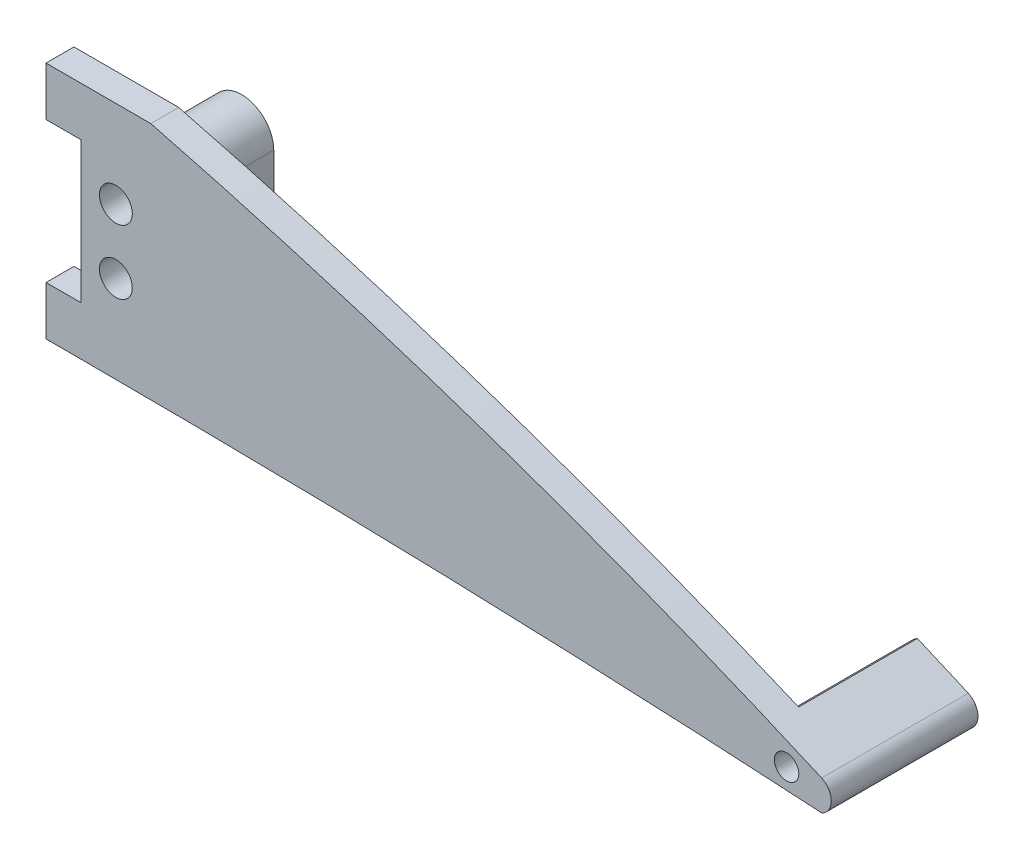
ISO-10303-21;
HEADER;
FILE_DESCRIPTION(('STEP AP214'),'2;1');
FILE_NAME('part.step','',(''),(''),'','','');
FILE_SCHEMA(('AUTOMOTIVE_DESIGN { 1 0 10303 214 1 1 1 1 }'));
ENDSEC;
DATA;
#1=APPLICATION_CONTEXT('core data for automotive mechanical design processes');
#2=APPLICATION_PROTOCOL_DEFINITION('international standard','automotive_design',2000,#1);
#3=PRODUCT_CONTEXT('',#1,'mechanical');
#4=PRODUCT('Part','Part','',(#3));
#5=PRODUCT_RELATED_PRODUCT_CATEGORY('part','',(#4));
#6=PRODUCT_DEFINITION_FORMATION('','',#4);
#7=PRODUCT_DEFINITION_CONTEXT('part definition',#1,'design');
#8=PRODUCT_DEFINITION('design','',#6,#7);
#9=PRODUCT_DEFINITION_SHAPE('','',#8);
#10=(LENGTH_UNIT() NAMED_UNIT(*) SI_UNIT(.MILLI.,.METRE.));
#11=(NAMED_UNIT(*) PLANE_ANGLE_UNIT() SI_UNIT($,.RADIAN.));
#12=(NAMED_UNIT(*) SI_UNIT($,.STERADIAN.) SOLID_ANGLE_UNIT());
#13=UNCERTAINTY_MEASURE_WITH_UNIT(LENGTH_MEASURE(1.E-05),#10,'distance_accuracy_value','');
#14=(GEOMETRIC_REPRESENTATION_CONTEXT(3) GLOBAL_UNCERTAINTY_ASSIGNED_CONTEXT((#13)) GLOBAL_UNIT_ASSIGNED_CONTEXT((#10,
#11,#12)) REPRESENTATION_CONTEXT('',''));
#15=CARTESIAN_POINT('',(0.,0.,0.));
#16=DIRECTION('',(0.,0.,1.));
#17=DIRECTION('',(1.,0.,0.));
#18=AXIS2_PLACEMENT_3D('',#15,#16,#17);
#19=CARTESIAN_POINT('',(125.2,-18.184180882781,-4.));
#20=DIRECTION('',(0.,0.,1.));
#21=DIRECTION('',(-1.,0.,0.));
#22=AXIS2_PLACEMENT_3D('',#19,#20,#21);
#23=PLANE('',#22);
#24=CARTESIAN_POINT('',(121.606035169385,-17.1322224625287,-4.));
#25=DIRECTION('',(0.,0.,1.));
#26=DIRECTION('',(-1.,0.,0.));
#27=AXIS2_PLACEMENT_3D('',#24,#25,#26);
#28=CIRCLE('',#27,5.04570951350734);
#29=CARTESIAN_POINT('',(118.922411718287,-12.859360462951,-4.));
#30=VERTEX_POINT('',#29);
#31=CARTESIAN_POINT('',(117.333173169808,-19.8158459136246,-4.));
#32=VERTEX_POINT('',#31);
#33=EDGE_CURVE('E208',#30,#32,#28,.T.);
#34=ORIENTED_EDGE('',*,*,#33,.T.);
#35=CARTESIAN_POINT('',(19.1973795010577,-1791.50291617273,-4.));
#36=DIRECTION('',(0.,0.,-1.));
#37=DIRECTION('',(-1.,0.,0.));
#38=AXIS2_PLACEMENT_3D('',#35,#36,#37);
#39=CIRCLE('',#38,1774.40291617273);
#40=CARTESIAN_POINT('',(19.1973795010615,-17.1000000000001,-4.));
#41=VERTEX_POINT('',#40);
#42=EDGE_CURVE('E274',#41,#32,#39,.T.);
#43=ORIENTED_EDGE('',*,*,#42,.F.);
#44=DIRECTION('',(1.,0.,0.));
#45=VECTOR('',#44,1.);
#46=CARTESIAN_POINT('',(15.2,-17.1,-4.));
#47=LINE('',#46,#45);
#48=CARTESIAN_POINT('',(15.2,-17.1,-4.));
#49=VERTEX_POINT('',#48);
#50=EDGE_CURVE('E270',#49,#41,#47,.T.);
#51=ORIENTED_EDGE('',*,*,#50,.F.);
#52=DIRECTION('',(0.,-1.,0.));
#53=VECTOR('',#52,1.);
#54=CARTESIAN_POINT('',(15.2,-10.1,-4.));
#55=LINE('',#54,#53);
#56=CARTESIAN_POINT('',(15.2,-10.1,-4.));
#57=VERTEX_POINT('',#56);
#58=EDGE_CURVE('E266',#57,#49,#55,.T.);
#59=ORIENTED_EDGE('',*,*,#58,.F.);
#60=DIRECTION('',(-1.,0.,0.));
#61=VECTOR('',#60,1.);
#62=CARTESIAN_POINT('',(15.2,-10.1,-4.));
#63=LINE('',#62,#61);
#64=CARTESIAN_POINT('',(20.2,-10.1,-4.));
#65=VERTEX_POINT('',#64);
#66=EDGE_CURVE('E262',#65,#57,#63,.T.);
#67=ORIENTED_EDGE('',*,*,#66,.F.);
#68=DIRECTION('',(0.,-1.,0.));
#69=VECTOR('',#68,1.);
#70=CARTESIAN_POINT('',(20.2,10.1,-4.));
#71=LINE('',#70,#69);
#72=CARTESIAN_POINT('',(20.2,10.1,-4.));
#73=VERTEX_POINT('',#72);
#74=EDGE_CURVE('E258',#73,#65,#71,.T.);
#75=ORIENTED_EDGE('',*,*,#74,.F.);
#76=DIRECTION('',(1.,0.,0.));
#77=VECTOR('',#76,1.);
#78=CARTESIAN_POINT('',(15.2,10.1,-4.));
#79=LINE('',#78,#77);
#80=CARTESIAN_POINT('',(15.2,10.1,-4.));
#81=VERTEX_POINT('',#80);
#82=EDGE_CURVE('E254',#81,#73,#79,.T.);
#83=ORIENTED_EDGE('',*,*,#82,.F.);
#84=DIRECTION('',(0.,-1.,0.));
#85=VECTOR('',#84,1.);
#86=CARTESIAN_POINT('',(15.2,17.1,-4.));
#87=LINE('',#86,#85);
#88=CARTESIAN_POINT('',(15.2,17.1,-4.));
#89=VERTEX_POINT('',#88);
#90=EDGE_CURVE('E250',#89,#81,#87,.T.);
#91=ORIENTED_EDGE('',*,*,#90,.F.);
#92=DIRECTION('',(-1.,0.,0.));
#93=VECTOR('',#92,1.);
#94=CARTESIAN_POINT('',(15.2,17.1,-4.));
#95=LINE('',#94,#93);
#96=CARTESIAN_POINT('',(30.2000000000001,17.1000000000001,-4.));
#97=VERTEX_POINT('',#96);
#98=EDGE_CURVE('E245',#97,#89,#95,.T.);
#99=ORIENTED_EDGE('',*,*,#98,.F.);
#100=CARTESIAN_POINT('',(-123.166643251558,-583.435959333798,-4.));
#101=DIRECTION('',(0.,0.,1.));
#102=DIRECTION('',(-1.,0.,0.));
#103=AXIS2_PLACEMENT_3D('',#100,#101,#102);
#104=CIRCLE('',#103,619.810265900151);
#105=EDGE_CURVE('E241',#30,#97,#104,.T.);
#106=ORIENTED_EDGE('',*,*,#105,.F.);
#107=EDGE_LOOP('',(#34,#43,#51,#59,#67,#75,#83,#91,#99,#106));
#108=FACE_BOUND('',#107,.T.);
#109=CARTESIAN_POINT('',(25.2,-4.6,-4.));
#110=DIRECTION('',(0.,0.,1.));
#111=DIRECTION('',(1.,0.,0.));
#112=AXIS2_PLACEMENT_3D('',#109,#110,#111);
#113=CIRCLE('',#112,4.6);
#114=CARTESIAN_POINT('',(20.6,-4.6,-4.));
#115=VERTEX_POINT('',#114);
#116=CARTESIAN_POINT('',(29.8,-4.6,-4.));
#117=VERTEX_POINT('',#116);
#118=EDGE_CURVE('E190',#115,#117,#113,.T.);
#119=ORIENTED_EDGE('',*,*,#118,.T.);
#120=DIRECTION('',(0.,1.,0.));
#121=VECTOR('',#120,1.);
#122=CARTESIAN_POINT('',(29.8,-4.6,-4.));
#123=LINE('',#122,#121);
#124=CARTESIAN_POINT('',(29.8,4.6,-4.));
#125=VERTEX_POINT('',#124);
#126=EDGE_CURVE('E167',#117,#125,#123,.T.);
#127=ORIENTED_EDGE('',*,*,#126,.T.);
#128=CARTESIAN_POINT('',(25.2,4.6,-4.));
#129=DIRECTION('',(0.,0.,1.));
#130=DIRECTION('',(1.,0.,0.));
#131=AXIS2_PLACEMENT_3D('',#128,#129,#130);
#132=CIRCLE('',#131,4.6);
#133=CARTESIAN_POINT('',(20.6,4.6,-4.));
#134=VERTEX_POINT('',#133);
#135=EDGE_CURVE('E180',#125,#134,#132,.T.);
#136=ORIENTED_EDGE('',*,*,#135,.T.);
#137=DIRECTION('',(0.,-1.,0.));
#138=VECTOR('',#137,1.);
#139=CARTESIAN_POINT('',(20.6,-4.6,-4.));
#140=LINE('',#139,#138);
#141=EDGE_CURVE('E175',#134,#115,#140,.T.);
#142=ORIENTED_EDGE('',*,*,#141,.T.);
#143=EDGE_LOOP('',(#119,#127,#136,#142));
#144=FACE_BOUND('',#143,.T.);
#145=ADVANCED_FACE('F40',(#108,#144),#23,.F.);
#146=CARTESIAN_POINT('',(125.2,-18.184180882781,0.));
#147=DIRECTION('',(0.,0.,1.));
#148=DIRECTION('',(-1.,0.,0.));
#149=AXIS2_PLACEMENT_3D('',#146,#147,#148);
#150=PLANE('',#149);
#151=CARTESIAN_POINT('',(121.2,-17.1334379572921,0.));
#152=DIRECTION('',(0.,0.,-1.));
#153=DIRECTION('',(-1.,0.,0.));
#154=AXIS2_PLACEMENT_3D('',#151,#152,#153);
#155=CIRCLE('',#154,1.75);
#156=CARTESIAN_POINT('',(119.45,-17.1334379572921,0.));
#157=VERTEX_POINT('',#156);
#158=EDGE_CURVE('E183',#157,#157,#155,.T.);
#159=ORIENTED_EDGE('',*,*,#158,.T.);
#160=EDGE_LOOP('',(#159));
#161=FACE_BOUND('',#160,.T.);
#162=CARTESIAN_POINT('',(25.2,4.6,0.));
#163=DIRECTION('',(0.,0.,1.));
#164=DIRECTION('',(-1.,0.,0.));
#165=AXIS2_PLACEMENT_3D('',#162,#163,#164);
#166=CIRCLE('',#165,2.35);
#167=CARTESIAN_POINT('',(22.85,4.6,0.));
#168=VERTEX_POINT('',#167);
#169=EDGE_CURVE('E236',#168,#168,#166,.T.);
#170=ORIENTED_EDGE('',*,*,#169,.F.);
#171=EDGE_LOOP('',(#170));
#172=FACE_BOUND('',#171,.T.);
#173=CARTESIAN_POINT('',(125.2,-18.184180882781,0.));
#174=DIRECTION('',(0.,0.,1.));
#175=DIRECTION('',(-1.,0.,0.));
#176=AXIS2_PLACEMENT_3D('',#173,#174,#175);
#177=CIRCLE('',#176,2.40054797434142);
#178=CARTESIAN_POINT('',(126.269263580591,-20.3334379572921,0.));
#179=VERTEX_POINT('',#178);
#180=CARTESIAN_POINT('',(126.216652739476,-16.0095434912992,0.));
#181=VERTEX_POINT('',#180);
#182=EDGE_CURVE('E240',#179,#181,#177,.T.);
#183=ORIENTED_EDGE('',*,*,#182,.T.);
#184=CARTESIAN_POINT('',(-123.166643251558,-583.435959333798,0.));
#185=DIRECTION('',(0.,0.,1.));
#186=DIRECTION('',(-1.,0.,0.));
#187=AXIS2_PLACEMENT_3D('',#184,#185,#186);
#188=CIRCLE('',#187,619.810265900151);
#189=CARTESIAN_POINT('',(30.2000000000001,17.1000000000001,0.));
#190=VERTEX_POINT('',#189);
#191=EDGE_CURVE('E282',#181,#190,#188,.T.);
#192=ORIENTED_EDGE('',*,*,#191,.T.);
#193=DIRECTION('',(-1.,0.,0.));
#194=VECTOR('',#193,1.);
#195=CARTESIAN_POINT('',(15.2,17.1,0.));
#196=LINE('',#195,#194);
#197=CARTESIAN_POINT('',(15.2,17.1,0.));
#198=VERTEX_POINT('',#197);
#199=EDGE_CURVE('E286',#190,#198,#196,.T.);
#200=ORIENTED_EDGE('',*,*,#199,.T.);
#201=DIRECTION('',(0.,-1.,0.));
#202=VECTOR('',#201,1.);
#203=CARTESIAN_POINT('',(15.2,17.1,0.));
#204=LINE('',#203,#202);
#205=CARTESIAN_POINT('',(15.2,10.1,0.));
#206=VERTEX_POINT('',#205);
#207=EDGE_CURVE('E290',#198,#206,#204,.T.);
#208=ORIENTED_EDGE('',*,*,#207,.T.);
#209=DIRECTION('',(1.,0.,0.));
#210=VECTOR('',#209,1.);
#211=CARTESIAN_POINT('',(15.2,10.1,0.));
#212=LINE('',#211,#210);
#213=CARTESIAN_POINT('',(20.2,10.1,0.));
#214=VERTEX_POINT('',#213);
#215=EDGE_CURVE('E294',#206,#214,#212,.T.);
#216=ORIENTED_EDGE('',*,*,#215,.T.);
#217=DIRECTION('',(0.,-1.,0.));
#218=VECTOR('',#217,1.);
#219=CARTESIAN_POINT('',(20.2,10.1,0.));
#220=LINE('',#219,#218);
#221=CARTESIAN_POINT('',(20.2,-10.1,0.));
#222=VERTEX_POINT('',#221);
#223=EDGE_CURVE('E298',#214,#222,#220,.T.);
#224=ORIENTED_EDGE('',*,*,#223,.T.);
#225=DIRECTION('',(-1.,0.,0.));
#226=VECTOR('',#225,1.);
#227=CARTESIAN_POINT('',(15.2,-10.1,0.));
#228=LINE('',#227,#226);
#229=CARTESIAN_POINT('',(15.2,-10.1,0.));
#230=VERTEX_POINT('',#229);
#231=EDGE_CURVE('E302',#222,#230,#228,.T.);
#232=ORIENTED_EDGE('',*,*,#231,.T.);
#233=DIRECTION('',(0.,-1.,0.));
#234=VECTOR('',#233,1.);
#235=CARTESIAN_POINT('',(15.2,-10.1,0.));
#236=LINE('',#235,#234);
#237=CARTESIAN_POINT('',(15.2,-17.1,0.));
#238=VERTEX_POINT('',#237);
#239=EDGE_CURVE('E306',#230,#238,#236,.T.);
#240=ORIENTED_EDGE('',*,*,#239,.T.);
#241=DIRECTION('',(1.,0.,0.));
#242=VECTOR('',#241,1.);
#243=CARTESIAN_POINT('',(15.2,-17.1,0.));
#244=LINE('',#243,#242);
#245=CARTESIAN_POINT('',(19.1973795010615,-17.1000000000001,0.));
#246=VERTEX_POINT('',#245);
#247=EDGE_CURVE('E310',#238,#246,#244,.T.);
#248=ORIENTED_EDGE('',*,*,#247,.T.);
#249=CARTESIAN_POINT('',(19.1973795010577,-1791.50291617273,0.));
#250=DIRECTION('',(0.,0.,-1.));
#251=DIRECTION('',(-1.,0.,0.));
#252=AXIS2_PLACEMENT_3D('',#249,#250,#251);
#253=CIRCLE('',#252,1774.40291617273);
#254=EDGE_CURVE('E246',#246,#179,#253,.T.);
#255=ORIENTED_EDGE('',*,*,#254,.T.);
#256=EDGE_LOOP('',(#183,#192,#200,#208,#216,#224,#232,#240,#248,#255));
#257=FACE_BOUND('',#256,.T.);
#258=CARTESIAN_POINT('',(25.2,-4.6,0.));
#259=DIRECTION('',(0.,0.,1.));
#260=DIRECTION('',(1.,0.,0.));
#261=AXIS2_PLACEMENT_3D('',#258,#259,#260);
#262=CIRCLE('',#261,2.35);
#263=CARTESIAN_POINT('',(27.55,-4.6,0.));
#264=VERTEX_POINT('',#263);
#265=EDGE_CURVE('E232',#264,#264,#262,.T.);
#266=ORIENTED_EDGE('',*,*,#265,.F.);
#267=EDGE_LOOP('',(#266));
#268=FACE_BOUND('',#267,.T.);
#269=ADVANCED_FACE('F354',(#161,#172,#257,#268),#150,.T.);
#270=CARTESIAN_POINT('',(125.2,-18.184180882781,-4.));
#271=DIRECTION('',(0.,0.,1.));
#272=DIRECTION('',(-1.,0.,0.));
#273=AXIS2_PLACEMENT_3D('',#270,#271,#272);
#274=CYLINDRICAL_SURFACE('',#273,2.40054797434142);
#275=ORIENTED_EDGE('',*,*,#182,.F.);
#276=DIRECTION('',(0.,0.,1.));
#277=VECTOR('',#276,1.);
#278=CARTESIAN_POINT('',(126.269263580591,-20.3334379572921,-4.));
#279=LINE('',#278,#277);
#280=CARTESIAN_POINT('',(126.269263580591,-20.3334379572921,-21.));
#281=VERTEX_POINT('',#280);
#282=EDGE_CURVE('E278',#281,#179,#279,.T.);
#283=ORIENTED_EDGE('',*,*,#282,.F.);
#284=CARTESIAN_POINT('',(125.2,-18.184180882781,-21.));
#285=DIRECTION('',(0.,0.,1.));
#286=DIRECTION('',(1.,0.,0.));
#287=AXIS2_PLACEMENT_3D('',#284,#285,#286);
#288=CIRCLE('',#287,2.40054797434144);
#289=CARTESIAN_POINT('',(126.216652739476,-16.0095434912992,-21.));
#290=VERTEX_POINT('',#289);
#291=EDGE_CURVE('E209',#281,#290,#288,.T.);
#292=ORIENTED_EDGE('',*,*,#291,.T.);
#293=DIRECTION('',(0.,0.,1.));
#294=VECTOR('',#293,1.);
#295=CARTESIAN_POINT('',(126.216652739476,-16.0095434912992,-4.));
#296=LINE('',#295,#294);
#297=EDGE_CURVE('E11',#290,#181,#296,.T.);
#298=ORIENTED_EDGE('',*,*,#297,.T.);
#299=EDGE_LOOP('',(#275,#283,#292,#298));
#300=FACE_BOUND('',#299,.T.);
#301=ADVANCED_FACE('F42',(#300),#274,.T.);
#302=CARTESIAN_POINT('',(-123.166643251558,-583.435959333798,-4.));
#303=DIRECTION('',(0.,0.,1.));
#304=DIRECTION('',(-1.,0.,0.));
#305=AXIS2_PLACEMENT_3D('',#302,#303,#304);
#306=CYLINDRICAL_SURFACE('',#305,619.810265900151);
#307=ORIENTED_EDGE('',*,*,#191,.F.);
#308=ORIENTED_EDGE('',*,*,#297,.F.);
#309=CARTESIAN_POINT('',(-123.166643251558,-583.435959333798,-21.));
#310=DIRECTION('',(0.,0.,1.));
#311=DIRECTION('',(1.,0.,0.));
#312=AXIS2_PLACEMENT_3D('',#309,#310,#311);
#313=CIRCLE('',#312,619.810265900151);
#314=CARTESIAN_POINT('',(118.922411718289,-12.859360462952,-21.));
#315=VERTEX_POINT('',#314);
#316=EDGE_CURVE('E213',#290,#315,#313,.T.);
#317=ORIENTED_EDGE('',*,*,#316,.T.);
#318=DIRECTION('',(0.,0.,1.));
#319=VECTOR('',#318,1.);
#320=CARTESIAN_POINT('',(118.922411718289,-12.859360462952,-21.));
#321=LINE('',#320,#319);
#322=EDGE_CURVE('E229',#315,#30,#321,.T.);
#323=ORIENTED_EDGE('',*,*,#322,.T.);
#324=ORIENTED_EDGE('',*,*,#105,.T.);
#325=DIRECTION('',(0.,0.,1.));
#326=VECTOR('',#325,1.);
#327=CARTESIAN_POINT('',(30.2000000000001,17.1000000000001,-4.));
#328=LINE('',#327,#326);
#329=EDGE_CURVE('E50',#97,#190,#328,.T.);
#330=ORIENTED_EDGE('',*,*,#329,.T.);
#331=EDGE_LOOP('',(#307,#308,#317,#323,#324,#330));
#332=FACE_BOUND('',#331,.T.);
#333=ADVANCED_FACE('F414',(#332),#306,.T.);
#334=CARTESIAN_POINT('',(15.2,17.1,-4.));
#335=DIRECTION('',(0.,-1.,0.));
#336=DIRECTION('',(0.,0.,1.));
#337=AXIS2_PLACEMENT_3D('',#334,#335,#336);
#338=PLANE('',#337);
#339=ORIENTED_EDGE('',*,*,#199,.F.);
#340=ORIENTED_EDGE('',*,*,#329,.F.);
#341=ORIENTED_EDGE('',*,*,#98,.T.);
#342=DIRECTION('',(0.,0.,1.));
#343=VECTOR('',#342,1.);
#344=CARTESIAN_POINT('',(15.2,17.1,-4.));
#345=LINE('',#344,#343);
#346=EDGE_CURVE('E337',#89,#198,#345,.T.);
#347=ORIENTED_EDGE('',*,*,#346,.T.);
#348=EDGE_LOOP('',(#339,#340,#341,#347));
#349=FACE_BOUND('',#348,.T.);
#350=ADVANCED_FACE('F411',(#349),#338,.F.);
#351=CARTESIAN_POINT('',(15.2,17.1,-4.));
#352=DIRECTION('',(1.,0.,0.));
#353=DIRECTION('',(0.,1.,0.));
#354=AXIS2_PLACEMENT_3D('',#351,#352,#353);
#355=PLANE('',#354);
#356=ORIENTED_EDGE('',*,*,#207,.F.);
#357=ORIENTED_EDGE('',*,*,#346,.F.);
#358=ORIENTED_EDGE('',*,*,#90,.T.);
#359=DIRECTION('',(0.,0.,1.));
#360=VECTOR('',#359,1.);
#361=CARTESIAN_POINT('',(15.2,10.1,-4.));
#362=LINE('',#361,#360);
#363=EDGE_CURVE('E334',#81,#206,#362,.T.);
#364=ORIENTED_EDGE('',*,*,#363,.T.);
#365=EDGE_LOOP('',(#356,#357,#358,#364));
#366=FACE_BOUND('',#365,.T.);
#367=ADVANCED_FACE('F407',(#366),#355,.F.);
#368=CARTESIAN_POINT('',(15.2,10.1,-4.));
#369=DIRECTION('',(0.,1.,0.));
#370=DIRECTION('',(0.,0.,-1.));
#371=AXIS2_PLACEMENT_3D('',#368,#369,#370);
#372=PLANE('',#371);
#373=ORIENTED_EDGE('',*,*,#215,.F.);
#374=ORIENTED_EDGE('',*,*,#363,.F.);
#375=ORIENTED_EDGE('',*,*,#82,.T.);
#376=DIRECTION('',(0.,0.,1.));
#377=VECTOR('',#376,1.);
#378=CARTESIAN_POINT('',(20.2,10.1,-4.));
#379=LINE('',#378,#377);
#380=EDGE_CURVE('E331',#73,#214,#379,.T.);
#381=ORIENTED_EDGE('',*,*,#380,.T.);
#382=EDGE_LOOP('',(#373,#374,#375,#381));
#383=FACE_BOUND('',#382,.T.);
#384=ADVANCED_FACE('F403',(#383),#372,.F.);
#385=CARTESIAN_POINT('',(20.2,10.1,-4.));
#386=DIRECTION('',(1.,0.,0.));
#387=DIRECTION('',(0.,0.,1.));
#388=AXIS2_PLACEMENT_3D('',#385,#386,#387);
#389=PLANE('',#388);
#390=ORIENTED_EDGE('',*,*,#223,.F.);
#391=ORIENTED_EDGE('',*,*,#380,.F.);
#392=ORIENTED_EDGE('',*,*,#74,.T.);
#393=DIRECTION('',(0.,0.,1.));
#394=VECTOR('',#393,1.);
#395=CARTESIAN_POINT('',(20.2,-10.1,-4.));
#396=LINE('',#395,#394);
#397=EDGE_CURVE('E328',#65,#222,#396,.T.);
#398=ORIENTED_EDGE('',*,*,#397,.T.);
#399=EDGE_LOOP('',(#390,#391,#392,#398));
#400=FACE_BOUND('',#399,.T.);
#401=ADVANCED_FACE('F399',(#400),#389,.F.);
#402=CARTESIAN_POINT('',(15.2,-10.1,-4.));
#403=DIRECTION('',(0.,-1.,0.));
#404=DIRECTION('',(1.,0.,0.));
#405=AXIS2_PLACEMENT_3D('',#402,#403,#404);
#406=PLANE('',#405);
#407=ORIENTED_EDGE('',*,*,#231,.F.);
#408=ORIENTED_EDGE('',*,*,#397,.F.);
#409=ORIENTED_EDGE('',*,*,#66,.T.);
#410=DIRECTION('',(0.,0.,1.));
#411=VECTOR('',#410,1.);
#412=CARTESIAN_POINT('',(15.2,-10.1,-4.));
#413=LINE('',#412,#411);
#414=EDGE_CURVE('E325',#57,#230,#413,.T.);
#415=ORIENTED_EDGE('',*,*,#414,.T.);
#416=EDGE_LOOP('',(#407,#408,#409,#415));
#417=FACE_BOUND('',#416,.T.);
#418=ADVANCED_FACE('F395',(#417),#406,.F.);
#419=CARTESIAN_POINT('',(15.2,-10.1,-4.));
#420=DIRECTION('',(1.,0.,0.));
#421=DIRECTION('',(0.,1.,0.));
#422=AXIS2_PLACEMENT_3D('',#419,#420,#421);
#423=PLANE('',#422);
#424=ORIENTED_EDGE('',*,*,#239,.F.);
#425=ORIENTED_EDGE('',*,*,#414,.F.);
#426=ORIENTED_EDGE('',*,*,#58,.T.);
#427=DIRECTION('',(0.,0.,1.));
#428=VECTOR('',#427,1.);
#429=CARTESIAN_POINT('',(15.2,-17.1,-4.));
#430=LINE('',#429,#428);
#431=EDGE_CURVE('E322',#49,#238,#430,.T.);
#432=ORIENTED_EDGE('',*,*,#431,.T.);
#433=EDGE_LOOP('',(#424,#425,#426,#432));
#434=FACE_BOUND('',#433,.T.);
#435=ADVANCED_FACE('F391',(#434),#423,.F.);
#436=CARTESIAN_POINT('',(15.2,-17.1,-4.));
#437=DIRECTION('',(0.,1.,0.));
#438=DIRECTION('',(-1.,0.,0.));
#439=AXIS2_PLACEMENT_3D('',#436,#437,#438);
#440=PLANE('',#439);
#441=ORIENTED_EDGE('',*,*,#247,.F.);
#442=ORIENTED_EDGE('',*,*,#431,.F.);
#443=ORIENTED_EDGE('',*,*,#50,.T.);
#444=DIRECTION('',(0.,0.,1.));
#445=VECTOR('',#444,1.);
#446=CARTESIAN_POINT('',(19.1973795010615,-17.1000000000001,-4.));
#447=LINE('',#446,#445);
#448=EDGE_CURVE('E319',#41,#246,#447,.T.);
#449=ORIENTED_EDGE('',*,*,#448,.T.);
#450=EDGE_LOOP('',(#441,#442,#443,#449));
#451=FACE_BOUND('',#450,.T.);
#452=ADVANCED_FACE('F387',(#451),#440,.F.);
#453=CARTESIAN_POINT('',(19.1973795010577,-1791.50291617273,-4.));
#454=DIRECTION('',(0.,0.,1.));
#455=DIRECTION('',(-1.,0.,0.));
#456=AXIS2_PLACEMENT_3D('',#453,#454,#455);
#457=CYLINDRICAL_SURFACE('',#456,1774.40291617273);
#458=ORIENTED_EDGE('',*,*,#254,.F.);
#459=ORIENTED_EDGE('',*,*,#448,.F.);
#460=ORIENTED_EDGE('',*,*,#42,.T.);
#461=DIRECTION('',(0.,0.,1.));
#462=VECTOR('',#461,1.);
#463=CARTESIAN_POINT('',(117.333173169808,-19.8158459136246,-21.));
#464=LINE('',#463,#462);
#465=CARTESIAN_POINT('',(117.333173169808,-19.8158459136246,-21.));
#466=VERTEX_POINT('',#465);
#467=EDGE_CURVE('E223',#466,#32,#464,.T.);
#468=ORIENTED_EDGE('',*,*,#467,.F.);
#469=CARTESIAN_POINT('',(19.1973795010577,-1791.50291617273,-21.));
#470=DIRECTION('',(0.,0.,-1.));
#471=DIRECTION('',(1.,0.,0.));
#472=AXIS2_PLACEMENT_3D('',#469,#470,#471);
#473=CIRCLE('',#472,1774.40291617273);
#474=EDGE_CURVE('E220',#466,#281,#473,.T.);
#475=ORIENTED_EDGE('',*,*,#474,.T.);
#476=ORIENTED_EDGE('',*,*,#282,.T.);
#477=EDGE_LOOP('',(#458,#459,#460,#468,#475,#476));
#478=FACE_BOUND('',#477,.T.);
#479=ADVANCED_FACE('F384',(#478),#457,.F.);
#480=CARTESIAN_POINT('',(25.2,4.6,-4.));
#481=DIRECTION('',(0.,0.,1.));
#482=DIRECTION('',(-1.,0.,0.));
#483=AXIS2_PLACEMENT_3D('',#480,#481,#482);
#484=CYLINDRICAL_SURFACE('',#483,2.35);
#485=ORIENTED_EDGE('',*,*,#169,.T.);
#486=EDGE_LOOP('',(#485));
#487=FACE_BOUND('',#486,.T.);
#488=CARTESIAN_POINT('',(25.2,4.6,-18.));
#489=DIRECTION('',(0.,0.,1.));
#490=DIRECTION('',(1.,0.,0.));
#491=AXIS2_PLACEMENT_3D('',#488,#489,#490);
#492=CIRCLE('',#491,2.35);
#493=CARTESIAN_POINT('',(27.55,4.6,-18.));
#494=VERTEX_POINT('',#493);
#495=EDGE_CURVE('E44',#494,#494,#492,.T.);
#496=ORIENTED_EDGE('',*,*,#495,.F.);
#497=EDGE_LOOP('',(#496));
#498=FACE_BOUND('',#497,.T.);
#499=ADVANCED_FACE('F381',(#487,#498),#484,.F.);
#500=CARTESIAN_POINT('',(25.2,-4.6,-4.));
#501=DIRECTION('',(0.,0.,1.));
#502=DIRECTION('',(-1.,0.,0.));
#503=AXIS2_PLACEMENT_3D('',#500,#501,#502);
#504=CYLINDRICAL_SURFACE('',#503,2.35);
#505=ORIENTED_EDGE('',*,*,#265,.T.);
#506=EDGE_LOOP('',(#505));
#507=FACE_BOUND('',#506,.T.);
#508=CARTESIAN_POINT('',(25.2,-4.6,-18.));
#509=DIRECTION('',(0.,0.,1.));
#510=DIRECTION('',(1.,0.,0.));
#511=AXIS2_PLACEMENT_3D('',#508,#509,#510);
#512=CIRCLE('',#511,2.35);
#513=CARTESIAN_POINT('',(27.55,-4.6,-18.));
#514=VERTEX_POINT('',#513);
#515=EDGE_CURVE('E341',#514,#514,#512,.T.);
#516=ORIENTED_EDGE('',*,*,#515,.F.);
#517=EDGE_LOOP('',(#516));
#518=FACE_BOUND('',#517,.T.);
#519=ADVANCED_FACE('F453',(#507,#518),#504,.F.);
#520=CARTESIAN_POINT('',(1.01667837422106,-300.81007010829,-21.));
#521=DIRECTION('',(0.,0.,-1.));
#522=DIRECTION('',(1.,0.,0.));
#523=AXIS2_PLACEMENT_3D('',#520,#521,#522);
#524=PLANE('',#523);
#525=ORIENTED_EDGE('',*,*,#291,.F.);
#526=ORIENTED_EDGE('',*,*,#474,.F.);
#527=CARTESIAN_POINT('',(121.606035169385,-17.1322224625287,-21.));
#528=DIRECTION('',(0.,0.,1.));
#529=DIRECTION('',(-1.,0.,0.));
#530=AXIS2_PLACEMENT_3D('',#527,#528,#529);
#531=CIRCLE('',#530,5.04570951350734);
#532=EDGE_CURVE('E217',#315,#466,#531,.T.);
#533=ORIENTED_EDGE('',*,*,#532,.F.);
#534=ORIENTED_EDGE('',*,*,#316,.F.);
#535=EDGE_LOOP('',(#525,#526,#533,#534));
#536=FACE_BOUND('',#535,.T.);
#537=CARTESIAN_POINT('',(121.2,-17.1334379572921,-21.));
#538=DIRECTION('',(0.,0.,1.));
#539=DIRECTION('',(1.,0.,0.));
#540=AXIS2_PLACEMENT_3D('',#537,#538,#539);
#541=CIRCLE('',#540,1.75);
#542=CARTESIAN_POINT('',(122.95,-17.1334379572921,-21.));
#543=VERTEX_POINT('',#542);
#544=EDGE_CURVE('E170',#543,#543,#541,.T.);
#545=ORIENTED_EDGE('',*,*,#544,.T.);
#546=EDGE_LOOP('',(#545));
#547=FACE_BOUND('',#546,.T.);
#548=ADVANCED_FACE('F367',(#536,#547),#524,.T.);
#549=CARTESIAN_POINT('',(121.606035169385,-17.1322224625287,-21.));
#550=DIRECTION('',(0.,0.,1.));
#551=DIRECTION('',(-1.,0.,0.));
#552=AXIS2_PLACEMENT_3D('',#549,#550,#551);
#553=CYLINDRICAL_SURFACE('',#552,5.04570951350734);
#554=ORIENTED_EDGE('',*,*,#33,.F.);
#555=ORIENTED_EDGE('',*,*,#322,.F.);
#556=ORIENTED_EDGE('',*,*,#532,.T.);
#557=ORIENTED_EDGE('',*,*,#467,.T.);
#558=EDGE_LOOP('',(#554,#555,#556,#557));
#559=FACE_BOUND('',#558,.T.);
#560=ADVANCED_FACE('F359',(#559),#553,.T.);
#561=CARTESIAN_POINT('',(121.2,-17.1334379572921,-21.));
#562=DIRECTION('',(0.,0.,1.));
#563=DIRECTION('',(-1.,0.,0.));
#564=AXIS2_PLACEMENT_3D('',#561,#562,#563);
#565=CYLINDRICAL_SURFACE('',#564,1.75);
#566=ORIENTED_EDGE('',*,*,#544,.F.);
#567=EDGE_LOOP('',(#566));
#568=FACE_BOUND('',#567,.T.);
#569=ORIENTED_EDGE('',*,*,#158,.F.);
#570=EDGE_LOOP('',(#569));
#571=FACE_BOUND('',#570,.T.);
#572=ADVANCED_FACE('F357',(#568,#571),#565,.F.);
#573=CARTESIAN_POINT('',(25.2,-4.6,-18.));
#574=DIRECTION('',(0.,0.,1.));
#575=DIRECTION('',(-1.,0.,0.));
#576=AXIS2_PLACEMENT_3D('',#573,#574,#575);
#577=CYLINDRICAL_SURFACE('',#576,4.6);
#578=ORIENTED_EDGE('',*,*,#118,.F.);
#579=DIRECTION('',(0.,0.,1.));
#580=VECTOR('',#579,1.);
#581=CARTESIAN_POINT('',(20.6,-4.6,-18.));
#582=LINE('',#581,#580);
#583=CARTESIAN_POINT('',(20.6,-4.6,-18.));
#584=VERTEX_POINT('',#583);
#585=EDGE_CURVE('E173',#584,#115,#582,.T.);
#586=ORIENTED_EDGE('',*,*,#585,.F.);
#587=CARTESIAN_POINT('',(25.2,-4.6,-18.));
#588=DIRECTION('',(0.,0.,1.));
#589=DIRECTION('',(1.,0.,0.));
#590=AXIS2_PLACEMENT_3D('',#587,#588,#589);
#591=CIRCLE('',#590,4.6);
#592=CARTESIAN_POINT('',(29.8,-4.6,-18.));
#593=VERTEX_POINT('',#592);
#594=EDGE_CURVE('E159',#584,#593,#591,.T.);
#595=ORIENTED_EDGE('',*,*,#594,.T.);
#596=DIRECTION('',(0.,0.,1.));
#597=VECTOR('',#596,1.);
#598=CARTESIAN_POINT('',(29.8,-4.6,-18.));
#599=LINE('',#598,#597);
#600=EDGE_CURVE('E58',#593,#117,#599,.T.);
#601=ORIENTED_EDGE('',*,*,#600,.T.);
#602=EDGE_LOOP('',(#578,#586,#595,#601));
#603=FACE_BOUND('',#602,.T.);
#604=ADVANCED_FACE('F172',(#603),#577,.T.);
#605=CARTESIAN_POINT('',(29.8,-4.6,-18.));
#606=DIRECTION('',(-1.,0.,0.));
#607=DIRECTION('',(0.,0.,-1.));
#608=AXIS2_PLACEMENT_3D('',#605,#606,#607);
#609=PLANE('',#608);
#610=ORIENTED_EDGE('',*,*,#126,.F.);
#611=ORIENTED_EDGE('',*,*,#600,.F.);
#612=DIRECTION('',(0.,1.,0.));
#613=VECTOR('',#612,1.);
#614=CARTESIAN_POINT('',(29.8,-4.6,-18.));
#615=LINE('',#614,#613);
#616=CARTESIAN_POINT('',(29.8,4.6,-18.));
#617=VERTEX_POINT('',#616);
#618=EDGE_CURVE('E157',#593,#617,#615,.T.);
#619=ORIENTED_EDGE('',*,*,#618,.T.);
#620=DIRECTION('',(0.,0.,1.));
#621=VECTOR('',#620,1.);
#622=CARTESIAN_POINT('',(29.8,4.6,-18.));
#623=LINE('',#622,#621);
#624=EDGE_CURVE('E65',#617,#125,#623,.T.);
#625=ORIENTED_EDGE('',*,*,#624,.T.);
#626=EDGE_LOOP('',(#610,#611,#619,#625));
#627=FACE_BOUND('',#626,.T.);
#628=ADVANCED_FACE('F165',(#627),#609,.F.);
#629=CARTESIAN_POINT('',(25.2,4.6,-18.));
#630=DIRECTION('',(0.,0.,1.));
#631=DIRECTION('',(-1.,0.,0.));
#632=AXIS2_PLACEMENT_3D('',#629,#630,#631);
#633=CYLINDRICAL_SURFACE('',#632,4.6);
#634=ORIENTED_EDGE('',*,*,#135,.F.);
#635=ORIENTED_EDGE('',*,*,#624,.F.);
#636=CARTESIAN_POINT('',(25.2,4.6,-18.));
#637=DIRECTION('',(0.,0.,1.));
#638=DIRECTION('',(1.,0.,0.));
#639=AXIS2_PLACEMENT_3D('',#636,#637,#638);
#640=CIRCLE('',#639,4.6);
#641=CARTESIAN_POINT('',(20.6,4.6,-18.));
#642=VERTEX_POINT('',#641);
#643=EDGE_CURVE('E162',#617,#642,#640,.T.);
#644=ORIENTED_EDGE('',*,*,#643,.T.);
#645=DIRECTION('',(0.,0.,1.));
#646=VECTOR('',#645,1.);
#647=CARTESIAN_POINT('',(20.6,4.6,-18.));
#648=LINE('',#647,#646);
#649=EDGE_CURVE('E200',#642,#134,#648,.T.);
#650=ORIENTED_EDGE('',*,*,#649,.T.);
#651=EDGE_LOOP('',(#634,#635,#644,#650));
#652=FACE_BOUND('',#651,.T.);
#653=ADVANCED_FACE('F476',(#652),#633,.T.);
#654=CARTESIAN_POINT('',(20.6,-4.6,-18.));
#655=DIRECTION('',(1.,0.,0.));
#656=DIRECTION('',(0.,0.,1.));
#657=AXIS2_PLACEMENT_3D('',#654,#655,#656);
#658=PLANE('',#657);
#659=ORIENTED_EDGE('',*,*,#141,.F.);
#660=ORIENTED_EDGE('',*,*,#649,.F.);
#661=DIRECTION('',(0.,-1.,0.));
#662=VECTOR('',#661,1.);
#663=CARTESIAN_POINT('',(20.6,-4.6,-18.));
#664=LINE('',#663,#662);
#665=EDGE_CURVE('E187',#642,#584,#664,.T.);
#666=ORIENTED_EDGE('',*,*,#665,.T.);
#667=ORIENTED_EDGE('',*,*,#585,.T.);
#668=EDGE_LOOP('',(#659,#660,#666,#667));
#669=FACE_BOUND('',#668,.T.);
#670=ADVANCED_FACE('F471',(#669),#658,.F.);
#671=CARTESIAN_POINT('',(25.2,-4.6,-18.));
#672=DIRECTION('',(0.,0.,-1.));
#673=DIRECTION('',(1.,0.,0.));
#674=AXIS2_PLACEMENT_3D('',#671,#672,#673);
#675=PLANE('',#674);
#676=ORIENTED_EDGE('',*,*,#495,.T.);
#677=EDGE_LOOP('',(#676));
#678=FACE_BOUND('',#677,.T.);
#679=ORIENTED_EDGE('',*,*,#515,.T.);
#680=EDGE_LOOP('',(#679));
#681=FACE_BOUND('',#680,.T.);
#682=ORIENTED_EDGE('',*,*,#594,.F.);
#683=ORIENTED_EDGE('',*,*,#665,.F.);
#684=ORIENTED_EDGE('',*,*,#643,.F.);
#685=ORIENTED_EDGE('',*,*,#618,.F.);
#686=EDGE_LOOP('',(#682,#683,#684,#685));
#687=FACE_BOUND('',#686,.T.);
#688=ADVANCED_FACE('F158',(#678,#681,#687),#675,.T.);
#689=CLOSED_SHELL('',(#145,#269,#301,#333,#350,#367,#384,#401,#418,#435,#452,#479,#499,#519,
#548,#560,#572,#604,#628,#653,#670,#688));
#690=MANIFOLD_SOLID_BREP('B2',#689);
#691=ADVANCED_BREP_SHAPE_REPRESENTATION('',(#18,#690),#14);
#692=SHAPE_DEFINITION_REPRESENTATION(#9,#691);
ENDSEC;
END-ISO-10303-21;
